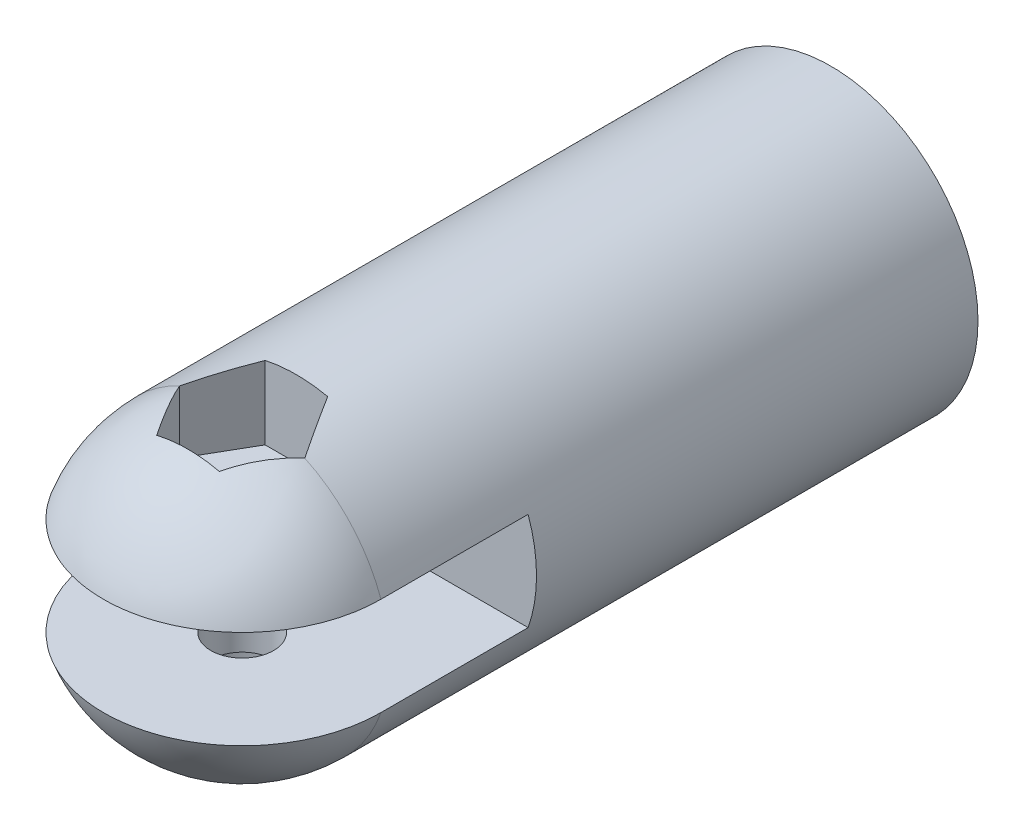
ISO-10303-21;
HEADER;
FILE_DESCRIPTION(('STEP AP214'),'2;1');
FILE_NAME('part.step','',(''),(''),'','','');
FILE_SCHEMA(('AUTOMOTIVE_DESIGN { 1 0 10303 214 1 1 1 1 }'));
ENDSEC;
DATA;
#1=APPLICATION_CONTEXT('core data for automotive mechanical design processes');
#2=APPLICATION_PROTOCOL_DEFINITION('international standard','automotive_design',2000,#1);
#3=PRODUCT_CONTEXT('',#1,'mechanical');
#4=PRODUCT('Part','Part','',(#3));
#5=PRODUCT_RELATED_PRODUCT_CATEGORY('part','',(#4));
#6=PRODUCT_DEFINITION_FORMATION('','',#4);
#7=PRODUCT_DEFINITION_CONTEXT('part definition',#1,'design');
#8=PRODUCT_DEFINITION('design','',#6,#7);
#9=PRODUCT_DEFINITION_SHAPE('','',#8);
#10=(LENGTH_UNIT() NAMED_UNIT(*) SI_UNIT(.MILLI.,.METRE.));
#11=(NAMED_UNIT(*) PLANE_ANGLE_UNIT() SI_UNIT($,.RADIAN.));
#12=(NAMED_UNIT(*) SI_UNIT($,.STERADIAN.) SOLID_ANGLE_UNIT());
#13=UNCERTAINTY_MEASURE_WITH_UNIT(LENGTH_MEASURE(1.E-05),#10,'distance_accuracy_value','');
#14=(GEOMETRIC_REPRESENTATION_CONTEXT(3) GLOBAL_UNCERTAINTY_ASSIGNED_CONTEXT((#13)) GLOBAL_UNIT_ASSIGNED_CONTEXT((#10,
#11,#12)) REPRESENTATION_CONTEXT('',''));
#15=CARTESIAN_POINT('',(0.,0.,0.));
#16=DIRECTION('',(0.,0.,1.));
#17=DIRECTION('',(1.,0.,0.));
#18=AXIS2_PLACEMENT_3D('',#15,#16,#17);
#19=CARTESIAN_POINT('',(0.,0.,12.));
#20=DIRECTION('',(0.,0.,1.));
#21=DIRECTION('',(1.,0.,0.));
#22=AXIS2_PLACEMENT_3D('',#19,#20,#21);
#23=PLANE('',#22);
#24=CARTESIAN_POINT('',(0.,0.,12.));
#25=DIRECTION('',(0.,0.,1.));
#26=DIRECTION('',(1.,0.,0.));
#27=AXIS2_PLACEMENT_3D('',#24,#25,#26);
#28=CIRCLE('',#27,2.95);
#29=CARTESIAN_POINT('',(2.95,0.,12.));
#30=VERTEX_POINT('',#29);
#31=EDGE_CURVE('E205',#30,#30,#28,.F.);
#32=ORIENTED_EDGE('',*,*,#31,.T.);
#33=EDGE_LOOP('',(#32));
#34=FACE_BOUND('',#33,.T.);
#35=ADVANCED_FACE('F17',(#34),#23,.F.);
#36=CARTESIAN_POINT('',(1.59499999999997,7.5,32.7626210380724));
#37=DIRECTION('',(0.866025403784431,0.,0.500000000000013));
#38=DIRECTION('',(0.500000000000013,0.,-0.866025403784431));
#39=AXIS2_PLACEMENT_3D('',#36,#37,#38);
#40=PLANE('',#39);
#41=DIRECTION('',(0.500000000000012,0.,-0.866025403784432));
#42=VECTOR('',#41,1.);
#43=CARTESIAN_POINT('',(1.59499999999997,3.6,32.7626210380724));
#44=LINE('',#43,#42);
#45=CARTESIAN_POINT('',(1.59499999999997,3.6,32.7626210380724));
#46=VERTEX_POINT('',#45);
#47=CARTESIAN_POINT('',(3.19000000000003,3.6,30.));
#48=VERTEX_POINT('',#47);
#49=EDGE_CURVE('E192',#46,#48,#44,.T.);
#50=ORIENTED_EDGE('',*,*,#49,.F.);
#51=DIRECTION('',(0.,1.,0.));
#52=VECTOR('',#51,1.);
#53=CARTESIAN_POINT('',(1.59499999999997,7.5,32.7626210380724));
#54=LINE('',#53,#52);
#55=CARTESIAN_POINT('',(1.59499999999997,6.78777577708634,32.7626210380724));
#56=VERTEX_POINT('',#55);
#57=EDGE_CURVE('E88',#46,#56,#54,.T.);
#58=ORIENTED_EDGE('',*,*,#57,.T.);
#59=CARTESIAN_POINT('',(3.19000000000003,6.78777577708632,30.));
#60=CARTESIAN_POINT('',(3.09368897155833,6.83306151722409,30.1668155945902));
#61=CARTESIAN_POINT('',(2.99640946405536,6.87010470442859,30.3353086441207));
#62=CARTESIAN_POINT('',(2.80058512184158,6.92754610230344,30.6744863541937));
#63=CARTESIAN_POINT('',(2.70203974432632,6.94793691280507,30.8451719549011));
#64=CARTESIAN_POINT('',(2.50632069477071,6.97164558532558,31.1841672927405));
#65=CARTESIAN_POINT('',(2.40915656886884,6.97528070333095,31.3524604954756));
#66=CARTESIAN_POINT('',(2.21506336085699,6.96632247222759,31.6886397931561));
#67=CARTESIAN_POINT('',(2.11813417753559,6.95373821732454,31.8565260634049));
#68=CARTESIAN_POINT('',(1.95013174236012,6.91779333062341,32.1475148169241));
#69=CARTESIAN_POINT('',(1.87885882471763,6.89806433040666,32.2709631314846));
#70=CARTESIAN_POINT('',(1.73655014006847,6.84966015391307,32.5174490036553));
#71=CARTESIAN_POINT('',(1.66551974466593,6.82092179847518,32.6404772573742));
#72=CARTESIAN_POINT('',(1.59499999999997,6.78777577708634,32.7626210380724));
#73=B_SPLINE_CURVE_WITH_KNOTS('',3,(#59,#60,#61,#62,#63,#64,#65,#66,#67,#68,#69,#70,#71,#72),
.UNSPECIFIED.,.F.,.F.,(4,2,2,2,2,2,4),(0.,0.593443529082145,1.18715063592653,1.76956889097802,
2.35166072601799,2.78311244401717,3.21766012736695),.UNSPECIFIED.);
#74=CARTESIAN_POINT('',(3.19000000000003,6.78777577708632,30.));
#75=VERTEX_POINT('',#74);
#76=EDGE_CURVE('E80',#75,#56,#73,.T.);
#77=ORIENTED_EDGE('',*,*,#76,.F.);
#78=DIRECTION('',(0.,1.,0.));
#79=VECTOR('',#78,1.);
#80=CARTESIAN_POINT('',(3.19000000000003,7.5,30.));
#81=LINE('',#80,#79);
#82=EDGE_CURVE('E85',#75,#48,#81,.F.);
#83=ORIENTED_EDGE('',*,*,#82,.T.);
#84=EDGE_LOOP('',(#50,#58,#77,#83));
#85=FACE_BOUND('',#84,.T.);
#86=ADVANCED_FACE('F83',(#85),#40,.F.);
#87=CARTESIAN_POINT('',(-1.59500000000001,7.5,32.7626210380724));
#88=DIRECTION('',(0.,0.,1.));
#89=DIRECTION('',(1.,0.,0.));
#90=AXIS2_PLACEMENT_3D('',#87,#88,#89);
#91=PLANE('',#90);
#92=DIRECTION('',(1.,0.,0.));
#93=VECTOR('',#92,1.);
#94=CARTESIAN_POINT('',(0.,3.6,32.7626210380724));
#95=LINE('',#94,#93);
#96=CARTESIAN_POINT('',(-1.59500000000001,3.6,32.7626210380724));
#97=VERTEX_POINT('',#96);
#98=EDGE_CURVE('E210',#97,#46,#95,.T.);
#99=ORIENTED_EDGE('',*,*,#98,.F.);
#100=DIRECTION('',(0.,1.,0.));
#101=VECTOR('',#100,1.);
#102=CARTESIAN_POINT('',(-1.59500000000001,7.5,32.7626210380724));
#103=LINE('',#102,#101);
#104=CARTESIAN_POINT('',(-1.59500000000001,6.78777577708634,32.7626210380724));
#105=VERTEX_POINT('',#104);
#106=EDGE_CURVE('E183',#97,#105,#103,.T.);
#107=ORIENTED_EDGE('',*,*,#106,.T.);
#108=CARTESIAN_POINT('',(0.,0.,32.7626210380724));
#109=DIRECTION('',(0.,0.,1.));
#110=DIRECTION('',(0.,-1.,0.));
#111=AXIS2_PLACEMENT_3D('',#108,#109,#110);
#112=CIRCLE('',#111,6.97265551995794);
#113=EDGE_CURVE('E94',#56,#105,#112,.T.);
#114=ORIENTED_EDGE('',*,*,#113,.F.);
#115=ORIENTED_EDGE('',*,*,#57,.F.);
#116=EDGE_LOOP('',(#99,#107,#114,#115));
#117=FACE_BOUND('',#116,.T.);
#118=ADVANCED_FACE('F326',(#117),#91,.F.);
#119=CARTESIAN_POINT('',(0.,3.6,0.));
#120=DIRECTION('',(0.,1.,0.));
#121=DIRECTION('',(0.,0.,1.));
#122=AXIS2_PLACEMENT_3D('',#119,#120,#121);
#123=PLANE('',#122);
#124=CARTESIAN_POINT('',(0.,3.6,30.));
#125=DIRECTION('',(0.,1.,0.));
#126=DIRECTION('',(0.,0.,1.));
#127=AXIS2_PLACEMENT_3D('',#124,#125,#126);
#128=CIRCLE('',#127,1.6);
#129=CARTESIAN_POINT('',(0.,3.6,31.6));
#130=VERTEX_POINT('',#129);
#131=EDGE_CURVE('E20',#130,#130,#128,.F.);
#132=ORIENTED_EDGE('',*,*,#131,.T.);
#133=EDGE_LOOP('',(#132));
#134=FACE_BOUND('',#133,.T.);
#135=DIRECTION('',(-1.,0.,0.));
#136=VECTOR('',#135,1.);
#137=CARTESIAN_POINT('',(1.595,3.6,27.2373789619276));
#138=LINE('',#137,#136);
#139=CARTESIAN_POINT('',(1.59500000000001,3.6,27.2373789619276));
#140=VERTEX_POINT('',#139);
#141=CARTESIAN_POINT('',(-1.59499999999996,3.6,27.2373789619277));
#142=VERTEX_POINT('',#141);
#143=EDGE_CURVE('E108',#140,#142,#138,.T.);
#144=ORIENTED_EDGE('',*,*,#143,.T.);
#145=DIRECTION('',(-0.500000000000018,0.,0.866025403784428));
#146=VECTOR('',#145,1.);
#147=CARTESIAN_POINT('',(-1.59499999999996,3.6,27.2373789619277));
#148=LINE('',#147,#146);
#149=CARTESIAN_POINT('',(-3.19000000000003,3.6,30.));
#150=VERTEX_POINT('',#149);
#151=EDGE_CURVE('E195',#142,#150,#148,.T.);
#152=ORIENTED_EDGE('',*,*,#151,.T.);
#153=DIRECTION('',(0.500000000000003,0.,0.866025403784437));
#154=VECTOR('',#153,1.);
#155=CARTESIAN_POINT('',(-3.19000000000003,3.6,30.));
#156=LINE('',#155,#154);
#157=EDGE_CURVE('E186',#150,#97,#156,.T.);
#158=ORIENTED_EDGE('',*,*,#157,.T.);
#159=ORIENTED_EDGE('',*,*,#98,.T.);
#160=ORIENTED_EDGE('',*,*,#49,.T.);
#161=DIRECTION('',(-0.500000000000007,0.,-0.866025403784435));
#162=VECTOR('',#161,1.);
#163=CARTESIAN_POINT('',(3.19000000000003,3.6,30.));
#164=LINE('',#163,#162);
#165=EDGE_CURVE('E106',#48,#140,#164,.T.);
#166=ORIENTED_EDGE('',*,*,#165,.T.);
#167=EDGE_LOOP('',(#144,#152,#158,#159,#160,#166));
#168=FACE_BOUND('',#167,.T.);
#169=ADVANCED_FACE('F329',(#134,#168),#123,.T.);
#170=CARTESIAN_POINT('',(-3.19000000000003,7.5,30.));
#171=DIRECTION('',(-0.866025403784437,0.,0.500000000000003));
#172=DIRECTION('',(0.500000000000003,0.,0.866025403784437));
#173=AXIS2_PLACEMENT_3D('',#170,#171,#172);
#174=PLANE('',#173);
#175=ORIENTED_EDGE('',*,*,#157,.F.);
#176=DIRECTION('',(0.,1.,0.));
#177=VECTOR('',#176,1.);
#178=CARTESIAN_POINT('',(-3.19000000000003,7.5,30.));
#179=LINE('',#178,#177);
#180=CARTESIAN_POINT('',(-3.19000000000003,6.78777577708632,30.));
#181=VERTEX_POINT('',#180);
#182=EDGE_CURVE('E153',#150,#181,#179,.T.);
#183=ORIENTED_EDGE('',*,*,#182,.T.);
#184=CARTESIAN_POINT('',(-1.59500000000001,6.78777577708633,32.7626210380724));
#185=CARTESIAN_POINT('',(-1.6913110284417,6.8330615172241,32.5958054434821));
#186=CARTESIAN_POINT('',(-1.78859053594468,6.8701047044286,32.4273123939517));
#187=CARTESIAN_POINT('',(-1.98441487815845,6.92754610230344,32.0881346838787));
#188=CARTESIAN_POINT('',(-2.08296025567371,6.94793691280507,31.9174490831712));
#189=CARTESIAN_POINT('',(-2.27867930522931,6.97164558532557,31.5784537453318));
#190=CARTESIAN_POINT('',(-2.37584343113119,6.97528070333094,31.4101605425968));
#191=CARTESIAN_POINT('',(-2.56993663914303,6.96632247222758,31.0739812449162));
#192=CARTESIAN_POINT('',(-2.66686582246443,6.95373821732453,30.9060949746674));
#193=CARTESIAN_POINT('',(-2.83486825763989,6.91779333062339,30.6151062211482));
#194=CARTESIAN_POINT('',(-2.90614117528238,6.89806433040665,30.4916579065877));
#195=CARTESIAN_POINT('',(-3.04844985993154,6.84966015391306,30.2451720344171));
#196=CARTESIAN_POINT('',(-3.11948025533408,6.82092179847517,30.1221437806982));
#197=CARTESIAN_POINT('',(-3.19000000000003,6.78777577708632,30.));
#198=B_SPLINE_CURVE_WITH_KNOTS('',3,(#184,#185,#186,#187,#188,#189,#190,#191,#192,#193,#194,
#195,#196,#197),.UNSPECIFIED.,.F.,.F.,(4,2,2,2,2,2,4),(0.,0.593443529082145,1.18715063592653,
1.76956889097802,2.351660726018,2.78311244401716,3.21766012736694),.UNSPECIFIED.);
#199=EDGE_CURVE('E154',#105,#181,#198,.T.);
#200=ORIENTED_EDGE('',*,*,#199,.F.);
#201=ORIENTED_EDGE('',*,*,#106,.F.);
#202=EDGE_LOOP('',(#175,#183,#200,#201));
#203=FACE_BOUND('',#202,.T.);
#204=ADVANCED_FACE('F332',(#203),#174,.F.);
#205=CARTESIAN_POINT('',(0.,7.5,30.));
#206=DIRECTION('',(0.,1.,0.));
#207=DIRECTION('',(0.,0.,1.));
#208=AXIS2_PLACEMENT_3D('',#205,#206,#207);
#209=CYLINDRICAL_SURFACE('',#208,1.6);
#210=CARTESIAN_POINT('',(0.,2.5,30.));
#211=DIRECTION('',(0.,1.,0.));
#212=DIRECTION('',(0.,0.,1.));
#213=AXIS2_PLACEMENT_3D('',#210,#211,#212);
#214=CIRCLE('',#213,1.6);
#215=CARTESIAN_POINT('',(0.,2.5,31.6));
#216=VERTEX_POINT('',#215);
#217=EDGE_CURVE('E142',#216,#216,#214,.F.);
#218=ORIENTED_EDGE('',*,*,#217,.T.);
#219=EDGE_LOOP('',(#218));
#220=FACE_BOUND('',#219,.T.);
#221=ORIENTED_EDGE('',*,*,#131,.F.);
#222=EDGE_LOOP('',(#221));
#223=FACE_BOUND('',#222,.T.);
#224=ADVANCED_FACE('F337',(#220,#223),#209,.F.);
#225=CARTESIAN_POINT('',(0.,0.,0.));
#226=DIRECTION('',(0.,0.,1.));
#227=DIRECTION('',(1.,0.,0.));
#228=AXIS2_PLACEMENT_3D('',#225,#226,#227);
#229=CYLINDRICAL_SURFACE('',#228,2.95);
#230=ORIENTED_EDGE('',*,*,#31,.F.);
#231=EDGE_LOOP('',(#230));
#232=FACE_BOUND('',#231,.T.);
#233=CARTESIAN_POINT('',(0.,0.,0.));
#234=DIRECTION('',(0.,0.,1.));
#235=DIRECTION('',(1.,0.,0.));
#236=AXIS2_PLACEMENT_3D('',#233,#234,#235);
#237=CIRCLE('',#236,2.95);
#238=CARTESIAN_POINT('',(2.95,0.,0.));
#239=VERTEX_POINT('',#238);
#240=EDGE_CURVE('E129',#239,#239,#237,.F.);
#241=ORIENTED_EDGE('',*,*,#240,.T.);
#242=EDGE_LOOP('',(#241));
#243=FACE_BOUND('',#242,.T.);
#244=ADVANCED_FACE('F341',(#232,#243),#229,.F.);
#245=CARTESIAN_POINT('',(1.595,7.5,27.2373789619276));
#246=DIRECTION('',(0.,0.,-1.));
#247=DIRECTION('',(-1.,0.,0.));
#248=AXIS2_PLACEMENT_3D('',#245,#246,#247);
#249=PLANE('',#248);
#250=ORIENTED_EDGE('',*,*,#143,.F.);
#251=DIRECTION('',(0.,1.,0.));
#252=VECTOR('',#251,1.);
#253=CARTESIAN_POINT('',(1.59500000000001,7.5,27.2373789619276));
#254=LINE('',#253,#252);
#255=CARTESIAN_POINT('',(1.59500000000001,7.32843605416599,27.2373789619276));
#256=VERTEX_POINT('',#255);
#257=EDGE_CURVE('E95',#140,#256,#254,.T.);
#258=ORIENTED_EDGE('',*,*,#257,.T.);
#259=CARTESIAN_POINT('',(0.,0.,27.2373789619277));
#260=DIRECTION('',(0.,0.,1.));
#261=DIRECTION('',(1.,0.,0.));
#262=AXIS2_PLACEMENT_3D('',#259,#260,#261);
#263=CIRCLE('',#262,7.5);
#264=CARTESIAN_POINT('',(-1.59499999999996,7.328436054166,27.2373789619277));
#265=VERTEX_POINT('',#264);
#266=EDGE_CURVE('E124',#265,#256,#263,.F.);
#267=ORIENTED_EDGE('',*,*,#266,.F.);
#268=DIRECTION('',(0.,1.,0.));
#269=VECTOR('',#268,1.);
#270=CARTESIAN_POINT('',(-1.59499999999996,7.5,27.2373789619277));
#271=LINE('',#270,#269);
#272=EDGE_CURVE('E199',#265,#142,#271,.F.);
#273=ORIENTED_EDGE('',*,*,#272,.T.);
#274=EDGE_LOOP('',(#250,#258,#267,#273));
#275=FACE_BOUND('',#274,.T.);
#276=ADVANCED_FACE('F344',(#275),#249,.F.);
#277=CARTESIAN_POINT('',(3.19000000000003,7.5,30.));
#278=DIRECTION('',(0.866025403784435,0.,-0.500000000000007));
#279=DIRECTION('',(-0.500000000000007,0.,-0.866025403784435));
#280=AXIS2_PLACEMENT_3D('',#277,#278,#279);
#281=PLANE('',#280);
#282=ORIENTED_EDGE('',*,*,#165,.F.);
#283=ORIENTED_EDGE('',*,*,#82,.F.);
#284=CARTESIAN_POINT('',(0.,0.,24.4747579238553));
#285=DIRECTION('',(0.866025403784435,0.,-0.500000000000007));
#286=DIRECTION('',(0.500000000000007,0.,0.866025403784435));
#287=AXIS2_PLACEMENT_3D('',#284,#285,#286);
#288=ELLIPSE('',#287,14.9999999999998,7.5);
#289=EDGE_CURVE('E103',#256,#75,#288,.T.);
#290=ORIENTED_EDGE('',*,*,#289,.F.);
#291=ORIENTED_EDGE('',*,*,#257,.F.);
#292=EDGE_LOOP('',(#282,#283,#290,#291));
#293=FACE_BOUND('',#292,.T.);
#294=ADVANCED_FACE('F100',(#293),#281,.F.);
#295=CARTESIAN_POINT('',(0.,0.,30.));
#296=DIRECTION('',(0.,0.,1.));
#297=DIRECTION('',(1.,-1.0723110266075E-12,0.));
#298=AXIS2_PLACEMENT_3D('',#295,#296,#297);
#299=SPHERICAL_SURFACE('',#298,7.5);
#300=ORIENTED_EDGE('',*,*,#113,.T.);
#301=ORIENTED_EDGE('',*,*,#199,.T.);
#302=CARTESIAN_POINT('',(0.,0.,30.));
#303=DIRECTION('',(0.,0.,1.));
#304=DIRECTION('',(1.,0.,0.));
#305=AXIS2_PLACEMENT_3D('',#302,#303,#304);
#306=CIRCLE('',#305,7.5);
#307=CARTESIAN_POINT('',(-7.07106781186547,2.5,30.));
#308=VERTEX_POINT('',#307);
#309=EDGE_CURVE('E293',#308,#181,#306,.F.);
#310=ORIENTED_EDGE('',*,*,#309,.F.);
#311=CARTESIAN_POINT('',(-7.07106781186548,2.5,30.));
#312=CARTESIAN_POINT('',(-7.07108919523174,2.5,30.1988760121894));
#313=CARTESIAN_POINT('',(-7.06267853373318,2.5,30.3977489504692));
#314=CARTESIAN_POINT('',(-7.02914756399679,2.5,30.7940720297359));
#315=CARTESIAN_POINT('',(-7.00402805584938,2.5,30.9915222383915));
#316=CARTESIAN_POINT('',(-6.93725728388824,2.5,31.3834647226214));
#317=CARTESIAN_POINT('',(-6.89561765298347,2.5,31.5779589798259));
#318=CARTESIAN_POINT('',(-6.79610956806594,2.5,31.9627479702105));
#319=CARTESIAN_POINT('',(-6.73824131125972,2.5,32.1530427543913));
#320=CARTESIAN_POINT('',(-6.60666621603039,2.5,32.5281369144731));
#321=CARTESIAN_POINT('',(-6.53295484589177,2.5,32.7129347007766));
#322=CARTESIAN_POINT('',(-6.37019761728929,2.5,33.0757315115315));
#323=CARTESIAN_POINT('',(-6.28114610340542,2.5,33.2537279988867));
#324=CARTESIAN_POINT('',(-6.08841533601745,2.5,33.6014853317685));
#325=CARTESIAN_POINT('',(-5.98474438680391,2.5,33.7712507797162));
#326=CARTESIAN_POINT('',(-5.76343249615044,2.5,34.1015085797886));
#327=CARTESIAN_POINT('',(-5.64578641286904,2.5,34.2619974863286));
#328=CARTESIAN_POINT('',(-5.39743457251295,2.5,34.5724391268754));
#329=CARTESIAN_POINT('',(-5.26673336071666,2.5,34.7223954971385));
#330=CARTESIAN_POINT('',(-4.9931153197014,2.5,35.0108210863353));
#331=CARTESIAN_POINT('',(-4.85019399749646,2.49999999999999,35.1492860430109));
#332=CARTESIAN_POINT('',(-4.55322588742855,2.50000000000001,35.4136536268738));
#333=CARTESIAN_POINT('',(-4.39918151645295,2.50000000000003,35.5395589690196));
#334=CARTESIAN_POINT('',(-4.0809759782525,2.49999999999997,35.7779906275529));
#335=CARTESIAN_POINT('',(-3.91681109597733,2.4999999999999,35.890511985994));
#336=CARTESIAN_POINT('',(-3.57965347275261,2.4999999999999,36.1012776626141));
#337=CARTESIAN_POINT('',(-3.40666440817743,2.49999999999997,36.1995278619225));
#338=CARTESIAN_POINT('',(-3.05296006249992,2.50000000000003,36.3811419017946));
#339=CARTESIAN_POINT('',(-2.87224195309967,2.50000000000001,36.464500234185));
#340=CARTESIAN_POINT('',(-2.50450426745306,2.49999999999999,36.6156603186179));
#341=CARTESIAN_POINT('',(-2.31748745037797,2.5,36.6834687832467));
#342=CARTESIAN_POINT('',(-1.93833734446921,2.5,36.8031154885929));
#343=CARTESIAN_POINT('',(-1.74620219805996,2.50000000000001,36.8549478429547));
#344=CARTESIAN_POINT('',(-1.35828177632951,2.5,36.9422322766909));
#345=CARTESIAN_POINT('',(-1.16249714203438,2.5,36.977687205045));
#346=CARTESIAN_POINT('',(-0.768632859514287,2.5,37.0319786338753));
#347=CARTESIAN_POINT('',(-0.570553162661357,2.5,37.0508147815767));
#348=CARTESIAN_POINT('',(-0.173508618505613,2.5,37.0717335743615));
#349=CARTESIAN_POINT('',(0.0254562397653972,2.5,37.0738160112647));
#350=CARTESIAN_POINT('',(0.42285411102364,2.5,37.0612120336176));
#351=CARTESIAN_POINT('',(0.621287124008525,2.5,37.0465256189932));
#352=CARTESIAN_POINT('',(1.01621067066963,2.5,37.0004883331755));
#353=CARTESIAN_POINT('',(1.21270120303675,2.5,36.9691374507523));
#354=CARTESIAN_POINT('',(1.60233852974132,2.5,36.8899949645172));
#355=CARTESIAN_POINT('',(1.79548539492834,2.5,36.8422037095123));
#356=CARTESIAN_POINT('',(2.17710313114901,2.5,36.7305093723999));
#357=CARTESIAN_POINT('',(2.36557310005077,2.5,36.6666032079992));
#358=CARTESIAN_POINT('',(2.73638993142326,2.5,36.5231645394383));
#359=CARTESIAN_POINT('',(2.91873902107593,2.5,36.4436377928598));
#360=CARTESIAN_POINT('',(3.27616163433066,2.5,36.2694737804627));
#361=CARTESIAN_POINT('',(3.45123225658916,2.5,36.1748305603362));
#362=CARTESIAN_POINT('',(3.79271316488044,2.5,35.9711669177079));
#363=CARTESIAN_POINT('',(3.95912662306032,2.5,35.8621518138239));
#364=CARTESIAN_POINT('',(4.2822317187242,2.5,35.6304550569559));
#365=CARTESIAN_POINT('',(4.43892022948172,2.5,35.5077690436337));
#366=CARTESIAN_POINT('',(4.74134717731035,2.5,35.2496790899006));
#367=CARTESIAN_POINT('',(4.88708963504531,2.5,35.1142798607904));
#368=CARTESIAN_POINT('',(5.1666855947336,2.5,34.8316541642887));
#369=CARTESIAN_POINT('',(5.30053629974971,2.5,34.6844249299082));
#370=CARTESIAN_POINT('',(5.55531156057891,2.5,34.3792700803665));
#371=CARTESIAN_POINT('',(5.67624086706832,2.5,34.2213484315027));
#372=CARTESIAN_POINT('',(5.90444933337812,2.5,33.8957701767162));
#373=CARTESIAN_POINT('',(6.01171904815588,2.5,33.7281069503049));
#374=CARTESIAN_POINT('',(6.21171072954261,2.5,33.3844006578229));
#375=CARTESIAN_POINT('',(6.30443805166246,2.5,33.2083607079163));
#376=CARTESIAN_POINT('',(6.47481713063716,2.5,32.8489189640707));
#377=CARTESIAN_POINT('',(6.5524539967457,2.5,32.6655101118839));
#378=CARTESIAN_POINT('',(6.6919594710386,2.5,32.2928678387952));
#379=CARTESIAN_POINT('',(6.75383399816045,2.5,32.1036366342587));
#380=CARTESIAN_POINT('',(6.86135286395437,2.5,31.7208485268629));
#381=CARTESIAN_POINT('',(6.90701500974898,2.5,31.5272966197228));
#382=CARTESIAN_POINT('',(6.98186277494894,2.5,31.1371121143253));
#383=CARTESIAN_POINT('',(7.01105648240669,2.5,30.9404810771576));
#384=CARTESIAN_POINT('',(7.04497162789937,2.5,30.6195184161427));
#385=CARTESIAN_POINT('',(7.05476393444189,2.5,30.4957005662394));
#386=CARTESIAN_POINT('',(7.06780734004418,2.5,30.2479261074567));
#387=CARTESIAN_POINT('',(7.07106922597273,2.5,30.1239700663518));
#388=CARTESIAN_POINT('',(7.07106781186547,2.5,30.));
#389=B_SPLINE_CURVE_WITH_KNOTS('',3,(#311,#312,#313,#314,#315,#316,#317,#318,#319,#320,#321,
#322,#323,#324,#325,#326,#327,#328,#329,#330,#331,#332,#333,#334,#335,#336,#337,#338,#339,#340,
#341,#342,#343,#344,#345,#346,#347,#348,#349,#350,#351,#352,#353,#354,#355,#356,#357,#358,#359,
#360,#361,#362,#363,#364,#365,#366,#367,#368,#369,#370,#371,#372,#373,#374,#375,#376,#377,#378,
#379,#380,#381,#382,#383,#384,#385,#386,#387,#388),.UNSPECIFIED.,.F.,.F.,(4,2,2,2,2,2,2,2,2,2,2,
2,2,2,2,2,2,2,2,2,2,2,2,2,2,2,2,2,2,2,2,2,2,2,2,2,2,2,4),(0.,0.59644593111562,1.19286330392754,
1.78886144319095,2.38485234033597,2.98101394029955,3.57739579819087,4.17344024721981,
4.76970468085003,5.36576223767646,5.96203989808921,6.55818838310605,7.15455702137228,
7.75067919523358,8.34702140708779,8.94310570255882,9.53940936190501,10.1356092505286,
10.7318217946665,11.3280417472737,11.9242617025119,12.5204820595347,13.1166897676367,
13.7130115987902,14.3091140430836,14.9054518710314,15.5015696278947,16.0978780637812,
16.6939663836169,17.2901945341538,17.8862027158952,18.4826208003085,19.0788187240977,
19.6756020017913,20.2721608491425,20.8680624148387,21.4636710633505,21.836126191904,
22.20796559437),.UNSPECIFIED.);
#390=CARTESIAN_POINT('',(7.07106781186547,2.5,30.));
#391=VERTEX_POINT('',#390);
#392=EDGE_CURVE('E114',#308,#391,#389,.T.);
#393=ORIENTED_EDGE('',*,*,#392,.T.);
#394=CARTESIAN_POINT('',(0.,0.,30.));
#395=DIRECTION('',(0.,0.,1.));
#396=DIRECTION('',(1.,0.,0.));
#397=AXIS2_PLACEMENT_3D('',#394,#395,#396);
#398=CIRCLE('',#397,7.5);
#399=EDGE_CURVE('E111',#75,#391,#398,.F.);
#400=ORIENTED_EDGE('',*,*,#399,.F.);
#401=ORIENTED_EDGE('',*,*,#76,.T.);
#402=EDGE_LOOP('',(#300,#301,#310,#393,#400,#401));
#403=FACE_BOUND('',#402,.T.);
#404=ADVANCED_FACE('F112',(#403),#299,.T.);
#405=CARTESIAN_POINT('',(-1.59499999999996,7.5,27.2373789619277));
#406=DIRECTION('',(-0.866025403784428,0.,-0.500000000000018));
#407=DIRECTION('',(-0.500000000000018,0.,0.866025403784428));
#408=AXIS2_PLACEMENT_3D('',#405,#406,#407);
#409=PLANE('',#408);
#410=ORIENTED_EDGE('',*,*,#151,.F.);
#411=ORIENTED_EDGE('',*,*,#272,.F.);
#412=CARTESIAN_POINT('',(0.,0.,24.4747579238555));
#413=DIRECTION('',(-0.866025403784428,0.,-0.500000000000018));
#414=DIRECTION('',(-0.500000000000018,0.,0.866025403784428));
#415=AXIS2_PLACEMENT_3D('',#412,#413,#414);
#416=ELLIPSE('',#415,14.9999999999995,7.5);
#417=EDGE_CURVE('E132',#181,#265,#416,.T.);
#418=ORIENTED_EDGE('',*,*,#417,.F.);
#419=ORIENTED_EDGE('',*,*,#182,.F.);
#420=EDGE_LOOP('',(#410,#411,#418,#419));
#421=FACE_BOUND('',#420,.T.);
#422=ADVANCED_FACE('F168',(#421),#409,.F.);
#423=CARTESIAN_POINT('',(9.34934437484985,2.5,37.5));
#424=DIRECTION('',(0.,1.,0.));
#425=DIRECTION('',(0.,0.,1.));
#426=AXIS2_PLACEMENT_3D('',#423,#424,#425);
#427=PLANE('',#426);
#428=ORIENTED_EDGE('',*,*,#217,.F.);
#429=EDGE_LOOP('',(#428));
#430=FACE_BOUND('',#429,.T.);
#431=DIRECTION('',(0.,0.,1.));
#432=VECTOR('',#431,1.);
#433=CARTESIAN_POINT('',(-7.07106781186547,2.5,0.));
#434=LINE('',#433,#432);
#435=CARTESIAN_POINT('',(-7.07106781186547,2.5,22.5));
#436=VERTEX_POINT('',#435);
#437=EDGE_CURVE('E296',#436,#308,#434,.T.);
#438=ORIENTED_EDGE('',*,*,#437,.F.);
#439=DIRECTION('',(1.,0.,0.));
#440=VECTOR('',#439,1.);
#441=CARTESIAN_POINT('',(0.,2.5,22.5));
#442=LINE('',#441,#440);
#443=CARTESIAN_POINT('',(7.07106781186547,2.5,22.5));
#444=VERTEX_POINT('',#443);
#445=EDGE_CURVE('E289',#444,#436,#442,.F.);
#446=ORIENTED_EDGE('',*,*,#445,.F.);
#447=DIRECTION('',(0.,0.,1.));
#448=VECTOR('',#447,1.);
#449=CARTESIAN_POINT('',(7.07106781186547,2.5,0.));
#450=LINE('',#449,#448);
#451=EDGE_CURVE('E119',#391,#444,#450,.F.);
#452=ORIENTED_EDGE('',*,*,#451,.F.);
#453=ORIENTED_EDGE('',*,*,#392,.F.);
#454=EDGE_LOOP('',(#438,#446,#452,#453));
#455=FACE_BOUND('',#454,.T.);
#456=ADVANCED_FACE('F160',(#430,#455),#427,.F.);
#457=CARTESIAN_POINT('',(0.,7.5,30.));
#458=DIRECTION('',(0.,1.,0.));
#459=DIRECTION('',(0.,0.,1.));
#460=AXIS2_PLACEMENT_3D('',#457,#458,#459);
#461=CYLINDRICAL_SURFACE('',#460,1.6);
#462=CARTESIAN_POINT('',(0.,-2.5,30.));
#463=DIRECTION('',(0.,1.,0.));
#464=DIRECTION('',(0.,0.,1.));
#465=AXIS2_PLACEMENT_3D('',#462,#463,#464);
#466=CIRCLE('',#465,1.6);
#467=CARTESIAN_POINT('',(0.,-2.5,31.6));
#468=VERTEX_POINT('',#467);
#469=EDGE_CURVE('E271',#468,#468,#466,.T.);
#470=ORIENTED_EDGE('',*,*,#469,.T.);
#471=EDGE_LOOP('',(#470));
#472=FACE_BOUND('',#471,.T.);
#473=CARTESIAN_POINT('',(0.,-4.5,30.));
#474=DIRECTION('',(0.,1.,0.));
#475=DIRECTION('',(0.,0.,1.));
#476=AXIS2_PLACEMENT_3D('',#473,#474,#475);
#477=CIRCLE('',#476,1.6);
#478=CARTESIAN_POINT('',(0.,-4.5,31.6));
#479=VERTEX_POINT('',#478);
#480=EDGE_CURVE('E138',#479,#479,#477,.T.);
#481=ORIENTED_EDGE('',*,*,#480,.F.);
#482=EDGE_LOOP('',(#481));
#483=FACE_BOUND('',#482,.T.);
#484=ADVANCED_FACE('F386',(#472,#483),#461,.F.);
#485=CARTESIAN_POINT('',(0.,-4.5,0.));
#486=DIRECTION('',(0.,-1.,0.));
#487=DIRECTION('',(0.,0.,-1.));
#488=AXIS2_PLACEMENT_3D('',#485,#486,#487);
#489=PLANE('',#488);
#490=ORIENTED_EDGE('',*,*,#480,.T.);
#491=EDGE_LOOP('',(#490));
#492=FACE_BOUND('',#491,.T.);
#493=CARTESIAN_POINT('',(0.,-4.5,30.));
#494=DIRECTION('',(0.,-1.,0.));
#495=DIRECTION('',(0.,0.,-1.));
#496=AXIS2_PLACEMENT_3D('',#493,#494,#495);
#497=CIRCLE('',#496,2.75);
#498=CARTESIAN_POINT('',(0.,-4.5,27.25));
#499=VERTEX_POINT('',#498);
#500=EDGE_CURVE('E258',#499,#499,#497,.T.);
#501=ORIENTED_EDGE('',*,*,#500,.T.);
#502=EDGE_LOOP('',(#501));
#503=FACE_BOUND('',#502,.T.);
#504=ADVANCED_FACE('F391',(#492,#503),#489,.T.);
#505=CARTESIAN_POINT('',(0.,0.,0.));
#506=DIRECTION('',(0.,0.,1.));
#507=DIRECTION('',(1.,0.,0.));
#508=AXIS2_PLACEMENT_3D('',#505,#506,#507);
#509=PLANE('',#508);
#510=ORIENTED_EDGE('',*,*,#240,.F.);
#511=EDGE_LOOP('',(#510));
#512=FACE_BOUND('',#511,.T.);
#513=CARTESIAN_POINT('',(0.,0.,0.));
#514=DIRECTION('',(0.,0.,1.));
#515=DIRECTION('',(1.,0.,0.));
#516=AXIS2_PLACEMENT_3D('',#513,#514,#515);
#517=CIRCLE('',#516,7.5);
#518=CARTESIAN_POINT('',(7.5,0.,0.));
#519=VERTEX_POINT('',#518);
#520=EDGE_CURVE('E247',#519,#519,#517,.T.);
#521=ORIENTED_EDGE('',*,*,#520,.F.);
#522=EDGE_LOOP('',(#521));
#523=FACE_BOUND('',#522,.T.);
#524=ADVANCED_FACE('F407',(#512,#523),#509,.F.);
#525=CARTESIAN_POINT('',(0.,0.,22.5));
#526=DIRECTION('',(0.,0.,1.));
#527=DIRECTION('',(1.,0.,0.));
#528=AXIS2_PLACEMENT_3D('',#525,#526,#527);
#529=PLANE('',#528);
#530=CARTESIAN_POINT('',(0.,0.,22.5));
#531=DIRECTION('',(0.,0.,1.));
#532=DIRECTION('',(1.,0.,0.));
#533=AXIS2_PLACEMENT_3D('',#530,#531,#532);
#534=CIRCLE('',#533,7.5);
#535=CARTESIAN_POINT('',(7.07106781186547,-2.5,22.5));
#536=VERTEX_POINT('',#535);
#537=EDGE_CURVE('E231',#444,#536,#534,.F.);
#538=ORIENTED_EDGE('',*,*,#537,.F.);
#539=ORIENTED_EDGE('',*,*,#445,.T.);
#540=CARTESIAN_POINT('',(0.,0.,22.5));
#541=DIRECTION('',(0.,0.,1.));
#542=DIRECTION('',(1.,0.,0.));
#543=AXIS2_PLACEMENT_3D('',#540,#541,#542);
#544=CIRCLE('',#543,7.5);
#545=CARTESIAN_POINT('',(-7.07106781186548,-2.5,22.5));
#546=VERTEX_POINT('',#545);
#547=EDGE_CURVE('E250',#546,#436,#544,.F.);
#548=ORIENTED_EDGE('',*,*,#547,.F.);
#549=DIRECTION('',(1.,0.,0.));
#550=VECTOR('',#549,1.);
#551=CARTESIAN_POINT('',(-10.1456607727077,-2.5,22.5));
#552=LINE('',#551,#550);
#553=EDGE_CURVE('E285',#546,#536,#552,.T.);
#554=ORIENTED_EDGE('',*,*,#553,.T.);
#555=EDGE_LOOP('',(#538,#539,#548,#554));
#556=FACE_BOUND('',#555,.T.);
#557=ADVANCED_FACE('F370',(#556),#529,.T.);
#558=CARTESIAN_POINT('',(-10.1456607727077,-2.5,37.5));
#559=DIRECTION('',(0.,-1.,0.));
#560=DIRECTION('',(0.,0.,-1.));
#561=AXIS2_PLACEMENT_3D('',#558,#559,#560);
#562=PLANE('',#561);
#563=ORIENTED_EDGE('',*,*,#469,.F.);
#564=EDGE_LOOP('',(#563));
#565=FACE_BOUND('',#564,.T.);
#566=DIRECTION('',(0.,0.,1.));
#567=VECTOR('',#566,1.);
#568=CARTESIAN_POINT('',(7.07106781186547,-2.5,0.));
#569=LINE('',#568,#567);
#570=CARTESIAN_POINT('',(7.07106781186548,-2.5,30.));
#571=VERTEX_POINT('',#570);
#572=EDGE_CURVE('E254',#536,#571,#569,.T.);
#573=ORIENTED_EDGE('',*,*,#572,.F.);
#574=ORIENTED_EDGE('',*,*,#553,.F.);
#575=DIRECTION('',(0.,0.,1.));
#576=VECTOR('',#575,1.);
#577=CARTESIAN_POINT('',(-7.07106781186548,-2.5,0.));
#578=LINE('',#577,#576);
#579=CARTESIAN_POINT('',(-7.07106781186547,-2.5,30.));
#580=VERTEX_POINT('',#579);
#581=EDGE_CURVE('E255',#580,#546,#578,.F.);
#582=ORIENTED_EDGE('',*,*,#581,.F.);
#583=CARTESIAN_POINT('',(7.07106781186548,-2.5,30.));
#584=CARTESIAN_POINT('',(7.07108919523174,-2.5,30.1988760121894));
#585=CARTESIAN_POINT('',(7.06267853373318,-2.5,30.3977489504692));
#586=CARTESIAN_POINT('',(7.0291475639968,-2.5,30.7940720297359));
#587=CARTESIAN_POINT('',(7.00402805584938,-2.5,30.9915222383915));
#588=CARTESIAN_POINT('',(6.93725728388824,-2.5,31.3834647226214));
#589=CARTESIAN_POINT('',(6.89561765298347,-2.5,31.5779589798259));
#590=CARTESIAN_POINT('',(6.79610956806594,-2.5,31.9627479702105));
#591=CARTESIAN_POINT('',(6.73824131125972,-2.5,32.1530427543913));
#592=CARTESIAN_POINT('',(6.60666621603039,-2.5,32.5281369144731));
#593=CARTESIAN_POINT('',(6.53295484589177,-2.5,32.7129347007766));
#594=CARTESIAN_POINT('',(6.37019761728929,-2.5,33.0757315115315));
#595=CARTESIAN_POINT('',(6.28114610340542,-2.5,33.2537279988866));
#596=CARTESIAN_POINT('',(6.08841533601745,-2.5,33.6014853317685));
#597=CARTESIAN_POINT('',(5.98474438680392,-2.5,33.7712507797162));
#598=CARTESIAN_POINT('',(5.76343249615044,-2.5,34.1015085797886));
#599=CARTESIAN_POINT('',(5.64578641286904,-2.5,34.2619974863286));
#600=CARTESIAN_POINT('',(5.39743457251296,-2.5,34.5724391268754));
#601=CARTESIAN_POINT('',(5.26673336071666,-2.5,34.7223954971385));
#602=CARTESIAN_POINT('',(4.9931153197014,-2.5,35.0108210863353));
#603=CARTESIAN_POINT('',(4.85019399749646,-2.49999999999999,35.1492860430109));
#604=CARTESIAN_POINT('',(4.55322588742855,-2.50000000000001,35.4136536268738));
#605=CARTESIAN_POINT('',(4.39918151645296,-2.50000000000003,35.5395589690196));
#606=CARTESIAN_POINT('',(4.0809759782525,-2.49999999999997,35.7779906275529));
#607=CARTESIAN_POINT('',(3.91681109597733,-2.4999999999999,35.890511985994));
#608=CARTESIAN_POINT('',(3.5796534727526,-2.4999999999999,36.1012776626141));
#609=CARTESIAN_POINT('',(3.40666440817742,-2.49999999999997,36.1995278619225));
#610=CARTESIAN_POINT('',(3.05296006249991,-2.50000000000003,36.3811419017946));
#611=CARTESIAN_POINT('',(2.87224195309967,-2.50000000000001,36.464500234185));
#612=CARTESIAN_POINT('',(2.50450426745305,-2.49999999999999,36.6156603186179));
#613=CARTESIAN_POINT('',(2.31748745037796,-2.5,36.6834687832467));
#614=CARTESIAN_POINT('',(1.9383373444692,-2.5,36.803115488593));
#615=CARTESIAN_POINT('',(1.74620219805995,-2.5,36.8549478429547));
#616=CARTESIAN_POINT('',(1.3582817763295,-2.5,36.9422322766909));
#617=CARTESIAN_POINT('',(1.16249714203438,-2.5,36.977687205045));
#618=CARTESIAN_POINT('',(0.768632859514283,-2.5,37.0319786338753));
#619=CARTESIAN_POINT('',(0.570553162661354,-2.5,37.0508147815767));
#620=CARTESIAN_POINT('',(0.17350861850561,-2.5,37.0717335743615));
#621=CARTESIAN_POINT('',(-0.0254562397653999,-2.5,37.0738160112647));
#622=CARTESIAN_POINT('',(-0.422854111023642,-2.5,37.0612120336176));
#623=CARTESIAN_POINT('',(-0.621287124008527,-2.5,37.0465256189932));
#624=CARTESIAN_POINT('',(-1.01621067066963,-2.5,37.0004883331755));
#625=CARTESIAN_POINT('',(-1.21270120303675,-2.5,36.9691374507523));
#626=CARTESIAN_POINT('',(-1.60233852974133,-2.5,36.8899949645172));
#627=CARTESIAN_POINT('',(-1.79548539492834,-2.5,36.8422037095123));
#628=CARTESIAN_POINT('',(-2.17710313114901,-2.5,36.7305093723999));
#629=CARTESIAN_POINT('',(-2.36557310005077,-2.5,36.6666032079992));
#630=CARTESIAN_POINT('',(-2.73638993142326,-2.5,36.5231645394383));
#631=CARTESIAN_POINT('',(-2.91873902107593,-2.5,36.4436377928598));
#632=CARTESIAN_POINT('',(-3.27616163433066,-2.5,36.2694737804627));
#633=CARTESIAN_POINT('',(-3.45123225658916,-2.5,36.1748305603362));
#634=CARTESIAN_POINT('',(-3.79271316488044,-2.5,35.9711669177079));
#635=CARTESIAN_POINT('',(-3.95912662306032,-2.5,35.8621518138239));
#636=CARTESIAN_POINT('',(-4.2822317187242,-2.5,35.6304550569559));
#637=CARTESIAN_POINT('',(-4.43892022948171,-2.5,35.5077690436337));
#638=CARTESIAN_POINT('',(-4.74134717731034,-2.5,35.2496790899006));
#639=CARTESIAN_POINT('',(-4.88708963504531,-2.5,35.1142798607904));
#640=CARTESIAN_POINT('',(-5.1666855947336,-2.5,34.8316541642887));
#641=CARTESIAN_POINT('',(-5.30053629974971,-2.5,34.6844249299082));
#642=CARTESIAN_POINT('',(-5.55531156057891,-2.5,34.3792700803665));
#643=CARTESIAN_POINT('',(-5.67624086706832,-2.5,34.2213484315027));
#644=CARTESIAN_POINT('',(-5.90444933337811,-2.5,33.8957701767162));
#645=CARTESIAN_POINT('',(-6.01171904815588,-2.5,33.7281069503049));
#646=CARTESIAN_POINT('',(-6.21171072954261,-2.5,33.3844006578229));
#647=CARTESIAN_POINT('',(-6.30443805166246,-2.5,33.2083607079163));
#648=CARTESIAN_POINT('',(-6.47481713063716,-2.5,32.8489189640707));
#649=CARTESIAN_POINT('',(-6.5524539967457,-2.5,32.6655101118839));
#650=CARTESIAN_POINT('',(-6.6919594710386,-2.5,32.2928678387952));
#651=CARTESIAN_POINT('',(-6.75383399816045,-2.5,32.1036366342588));
#652=CARTESIAN_POINT('',(-6.86135286395437,-2.5,31.7208485268629));
#653=CARTESIAN_POINT('',(-6.90701500974898,-2.5,31.5272966197228));
#654=CARTESIAN_POINT('',(-6.98186277494894,-2.5,31.1371121143253));
#655=CARTESIAN_POINT('',(-7.01105648240669,-2.5,30.9404810771576));
#656=CARTESIAN_POINT('',(-7.04497162789937,-2.5,30.6195184161427));
#657=CARTESIAN_POINT('',(-7.05476393444189,-2.5,30.4957005662395));
#658=CARTESIAN_POINT('',(-7.06780734004418,-2.5,30.2479261074567));
#659=CARTESIAN_POINT('',(-7.07106922597273,-2.5,30.1239700663518));
#660=CARTESIAN_POINT('',(-7.07106781186547,-2.5,30.));
#661=B_SPLINE_CURVE_WITH_KNOTS('',3,(#583,#584,#585,#586,#587,#588,#589,#590,#591,#592,#593,
#594,#595,#596,#597,#598,#599,#600,#601,#602,#603,#604,#605,#606,#607,#608,#609,#610,#611,#612,
#613,#614,#615,#616,#617,#618,#619,#620,#621,#622,#623,#624,#625,#626,#627,#628,#629,#630,#631,
#632,#633,#634,#635,#636,#637,#638,#639,#640,#641,#642,#643,#644,#645,#646,#647,#648,#649,#650,
#651,#652,#653,#654,#655,#656,#657,#658,#659,#660),.UNSPECIFIED.,.F.,.F.,(4,2,2,2,2,2,2,2,2,2,2,
2,2,2,2,2,2,2,2,2,2,2,2,2,2,2,2,2,2,2,2,2,2,2,2,2,2,2,4),(0.,0.59644593111562,1.19286330392754,
1.78886144319095,2.38485234033597,2.98101394029955,3.57739579819086,4.17344024721981,
4.76970468085003,5.36576223767645,5.96203989808921,6.55818838310605,7.15455702137229,
7.75067919523359,8.3470214070878,8.94310570255883,9.53940936190502,10.1356092505286,
10.7318217946665,11.3280417472738,11.9242617025119,12.5204820595347,13.1166897676367,
13.7130115987902,14.3091140430836,14.9054518710314,15.5015696278947,16.0978780637812,
16.6939663836169,17.2901945341538,17.8862027158952,18.4826208003085,19.0788187240977,
19.6756020017913,20.2721608491425,20.8680624148387,21.4636710633505,21.836126191904,
22.20796559437),.UNSPECIFIED.);
#662=EDGE_CURVE('E265',#571,#580,#661,.T.);
#663=ORIENTED_EDGE('',*,*,#662,.F.);
#664=EDGE_LOOP('',(#573,#574,#582,#663));
#665=FACE_BOUND('',#664,.T.);
#666=ADVANCED_FACE('F272',(#565,#665),#562,.F.);
#667=CARTESIAN_POINT('',(0.,0.,30.));
#668=DIRECTION('',(0.,0.,1.));
#669=DIRECTION('',(-1.,1.0728830517048E-12,0.));
#670=AXIS2_PLACEMENT_3D('',#667,#668,#669);
#671=SPHERICAL_SURFACE('',#670,7.5);
#672=CARTESIAN_POINT('',(0.,0.,30.));
#673=DIRECTION('',(0.,0.,1.));
#674=DIRECTION('',(1.,0.,0.));
#675=AXIS2_PLACEMENT_3D('',#672,#673,#674);
#676=CIRCLE('',#675,7.5);
#677=CARTESIAN_POINT('',(-2.75,-6.97764286847643,30.));
#678=VERTEX_POINT('',#677);
#679=EDGE_CURVE('E262',#678,#580,#676,.F.);
#680=ORIENTED_EDGE('',*,*,#679,.F.);
#681=CARTESIAN_POINT('',(0.,-6.97764286847643,30.));
#682=DIRECTION('',(0.,-1.,0.));
#683=DIRECTION('',(0.,0.,-1.));
#684=AXIS2_PLACEMENT_3D('',#681,#682,#683);
#685=CIRCLE('',#684,2.75);
#686=CARTESIAN_POINT('',(2.75,-6.97764286847643,30.));
#687=VERTEX_POINT('',#686);
#688=EDGE_CURVE('E36',#678,#687,#685,.F.);
#689=ORIENTED_EDGE('',*,*,#688,.T.);
#690=CARTESIAN_POINT('',(0.,0.,30.));
#691=DIRECTION('',(0.,0.,1.));
#692=DIRECTION('',(1.,0.,0.));
#693=AXIS2_PLACEMENT_3D('',#690,#691,#692);
#694=CIRCLE('',#693,7.5);
#695=EDGE_CURVE('E27',#571,#687,#694,.F.);
#696=ORIENTED_EDGE('',*,*,#695,.F.);
#697=ORIENTED_EDGE('',*,*,#662,.T.);
#698=EDGE_LOOP('',(#680,#689,#696,#697));
#699=FACE_BOUND('',#698,.T.);
#700=ADVANCED_FACE('F243',(#699),#671,.T.);
#701=CARTESIAN_POINT('',(0.,-7.5,30.));
#702=DIRECTION('',(0.,-1.,0.));
#703=DIRECTION('',(0.,0.,-1.));
#704=AXIS2_PLACEMENT_3D('',#701,#702,#703);
#705=CYLINDRICAL_SURFACE('',#704,2.75);
#706=ORIENTED_EDGE('',*,*,#500,.F.);
#707=EDGE_LOOP('',(#706));
#708=FACE_BOUND('',#707,.T.);
#709=ORIENTED_EDGE('',*,*,#688,.F.);
#710=CARTESIAN_POINT('',(2.75,-6.97764286847643,30.));
#711=CARTESIAN_POINT('',(2.75001040708344,-6.97762934802544,29.9254689385878));
#712=CARTESIAN_POINT('',(2.74697032012813,-6.97883669136921,29.8509453173716));
#713=CARTESIAN_POINT('',(2.73487035650354,-6.98359228100892,29.7024868756858));
#714=CARTESIAN_POINT('',(2.72581241636557,-6.9871397742474,29.6285518735429));
#715=CARTESIAN_POINT('',(2.70179897230506,-6.99645899995342,29.4820468306788));
#716=CARTESIAN_POINT('',(2.68686373910162,-7.0022230858765,29.4094729872686));
#717=CARTESIAN_POINT('',(2.65125562703788,-7.01578253682305,29.2659585420379));
#718=CARTESIAN_POINT('',(2.63058247449073,-7.02357799873785,29.1950180182982));
#719=CARTESIAN_POINT('',(2.56025463499294,-7.04965408250616,28.9854838323149));
#720=CARTESIAN_POINT('',(2.50224968809433,-7.07064170363172,28.8499255368524));
#721=CARTESIAN_POINT('',(2.36582956534626,-7.11744500094312,28.5904251771827));
#722=CARTESIAN_POINT('',(2.28739855177456,-7.14326441915933,28.4664922287724));
#723=CARTESIAN_POINT('',(2.10837804633835,-7.19818467483652,28.2278783418591));
#724=CARTESIAN_POINT('',(2.00698217404483,-7.22737877563693,28.1138225656274));
#725=CARTESIAN_POINT('',(1.78662714927863,-7.28497900385348,27.9039006600667));
#726=CARTESIAN_POINT('',(1.66766466603466,-7.31338498061893,27.8080379881916));
#727=CARTESIAN_POINT('',(1.41080626333303,-7.3673177403797,27.6342169391904));
#728=CARTESIAN_POINT('',(1.27242234932793,-7.39272165614511,27.5569380772893));
#729=CARTESIAN_POINT('',(0.983527305709946,-7.43666441320534,27.4270185447693));
#730=CARTESIAN_POINT('',(0.833020548561159,-7.45520571632464,27.3743690370721));
#731=CARTESIAN_POINT('',(0.53076240181248,-7.48267021963904,27.2973911417473));
#732=CARTESIAN_POINT('',(0.379320650923284,-7.49195991772317,27.2719802395644));
#733=CARTESIAN_POINT('',(0.0740537524856005,-7.50118690562469,27.2467378246127));
#734=CARTESIAN_POINT('',(-0.0797706834890911,-7.50112693579798,27.2468988168089));
#735=CARTESIAN_POINT('',(-0.37769341166793,-7.49189730148423,27.2721544030078));
#736=CARTESIAN_POINT('',(-0.521907438125846,-7.48315896630023,27.2960684383589));
#737=CARTESIAN_POINT('',(-0.804110223980385,-7.45811531546348,27.3661719978771));
#738=CARTESIAN_POINT('',(-0.942098629872529,-7.44180957070835,27.412362785231));
#739=CARTESIAN_POINT('',(-1.21027752476897,-7.40296328392114,27.5262854783316));
#740=CARTESIAN_POINT('',(-1.34032797251576,-7.38033676458311,27.5943165165722));
#741=CARTESIAN_POINT('',(-1.58748425619788,-7.33115247250316,27.7497286337212));
#742=CARTESIAN_POINT('',(-1.70458599089089,-7.3045934604185,27.8371158171271));
#743=CARTESIAN_POINT('',(-1.92948299504987,-7.24853622142546,28.0344935726123));
#744=CARTESIAN_POINT('',(-2.03638780732498,-7.21895669103046,28.1454770667533));
#745=CARTESIAN_POINT('',(-2.23041051777563,-7.16139212663993,28.3840140289096));
#746=CARTESIAN_POINT('',(-2.31752097901095,-7.13340769488778,28.5115736965633));
#747=CARTESIAN_POINT('',(-2.47109982216446,-7.08169394107571,28.7830388340343));
#748=CARTESIAN_POINT('',(-2.5370985609321,-7.05806581333022,28.9272302902223));
#749=CARTESIAN_POINT('',(-2.64347434759864,-7.01892478000246,29.2257005135991));
#750=CARTESIAN_POINT('',(-2.68389382556596,-7.00339844297385,29.3799621052706));
#751=CARTESIAN_POINT('',(-2.72376367739986,-6.98793844841584,29.6131507986424));
#752=CARTESIAN_POINT('',(-2.73359432621068,-6.98409160575995,29.6901758577288));
#753=CARTESIAN_POINT('',(-2.74671035548666,-6.97894032302531,29.8447858539364));
#754=CARTESIAN_POINT('',(-2.75000238746976,-6.97763329930236,29.9223701414301));
#755=CARTESIAN_POINT('',(-2.75,-6.97764286847643,30.));
#756=B_SPLINE_CURVE_WITH_KNOTS('',3,(#710,#711,#712,#713,#714,#715,#716,#717,#718,#719,#720,
#721,#722,#723,#724,#725,#726,#727,#728,#729,#730,#731,#732,#733,#734,#735,#736,#737,#738,#739,
#740,#741,#742,#743,#744,#745,#746,#747,#748,#749,#750,#751,#752,#753,#754,#755),.UNSPECIFIED.,
.F.,.F.,(4,2,2,2,2,2,2,2,2,2,2,2,2,2,2,2,2,2,2,2,2,2,4),(0.,0.223508949748574,0.446946009645968,
0.669619098299612,0.892302809823807,1.33691170823609,1.78186637394725,2.24591325551899,
2.71004823737503,3.1891977711592,3.6681752526927,4.12731788245938,4.58632593933467,
5.02360747737793,5.46091381406267,5.9044853120344,6.34819690228041,6.8167971688969,
7.28557320339826,7.764149996072,8.24193084544396,8.47488827553769,8.70760860414503),.UNSPECIFIED.);
#757=EDGE_CURVE('E11',#687,#678,#756,.T.);
#758=ORIENTED_EDGE('',*,*,#757,.F.);
#759=EDGE_LOOP('',(#709,#758));
#760=FACE_BOUND('',#759,.T.);
#761=ADVANCED_FACE('F233',(#708,#760),#705,.F.);
#762=CARTESIAN_POINT('',(0.,0.,0.));
#763=DIRECTION('',(0.,0.,1.));
#764=DIRECTION('',(1.,0.,0.));
#765=AXIS2_PLACEMENT_3D('',#762,#763,#764);
#766=CYLINDRICAL_SURFACE('',#765,7.5);
#767=ORIENTED_EDGE('',*,*,#520,.T.);
#768=EDGE_LOOP('',(#767));
#769=FACE_BOUND('',#768,.T.);
#770=ORIENTED_EDGE('',*,*,#695,.T.);
#771=ORIENTED_EDGE('',*,*,#757,.T.);
#772=ORIENTED_EDGE('',*,*,#679,.T.);
#773=ORIENTED_EDGE('',*,*,#581,.T.);
#774=ORIENTED_EDGE('',*,*,#547,.T.);
#775=ORIENTED_EDGE('',*,*,#437,.T.);
#776=ORIENTED_EDGE('',*,*,#309,.T.);
#777=ORIENTED_EDGE('',*,*,#417,.T.);
#778=ORIENTED_EDGE('',*,*,#266,.T.);
#779=ORIENTED_EDGE('',*,*,#289,.T.);
#780=ORIENTED_EDGE('',*,*,#399,.T.);
#781=ORIENTED_EDGE('',*,*,#451,.T.);
#782=ORIENTED_EDGE('',*,*,#537,.T.);
#783=ORIENTED_EDGE('',*,*,#572,.T.);
#784=EDGE_LOOP('',(#770,#771,#772,#773,#774,#775,#776,#777,#778,#779,#780,#781,#782,#783));
#785=FACE_BOUND('',#784,.T.);
#786=ADVANCED_FACE('F122',(#769,#785),#766,.T.);
#787=CLOSED_SHELL('',(#35,#86,#118,#169,#204,#224,#244,#276,#294,#404,#422,#456,#484,#504,#524,
#557,#666,#700,#761,#786));
#788=MANIFOLD_SOLID_BREP('B1',#787);
#789=ADVANCED_BREP_SHAPE_REPRESENTATION('',(#18,#788),#14);
#790=SHAPE_DEFINITION_REPRESENTATION(#9,#789);
ENDSEC;
END-ISO-10303-21;
